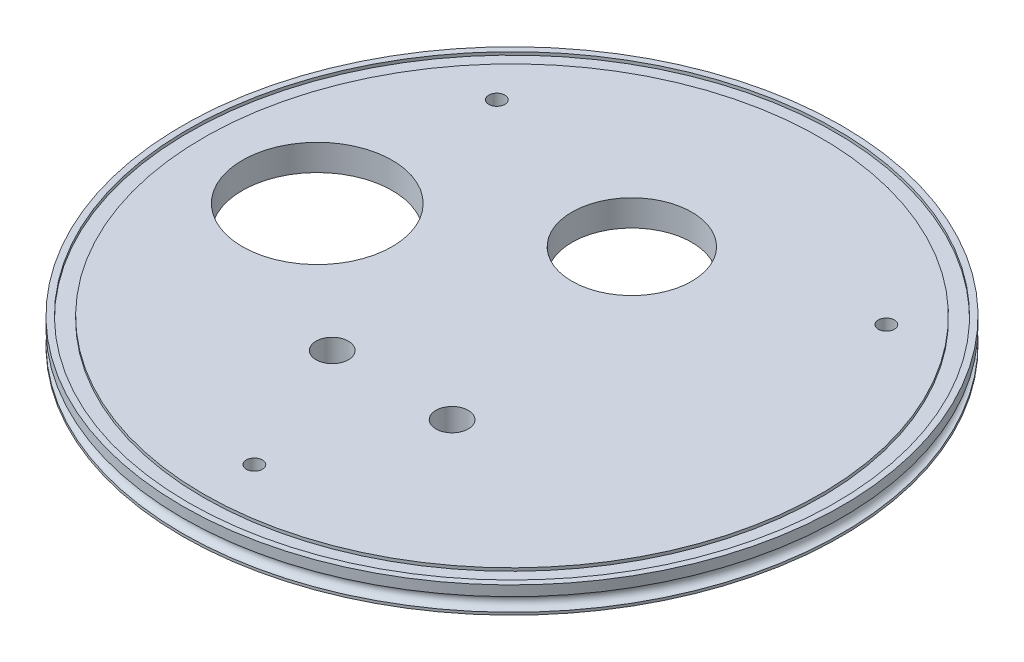
ISO-10303-21;
HEADER;
FILE_DESCRIPTION(('STEP AP214'),'2;1');
FILE_NAME('part.step','',(''),(''),'','','');
FILE_SCHEMA(('AUTOMOTIVE_DESIGN { 1 0 10303 214 1 1 1 1 }'));
ENDSEC;
DATA;
#1=APPLICATION_CONTEXT('core data for automotive mechanical design processes');
#2=APPLICATION_PROTOCOL_DEFINITION('international standard','automotive_design',2000,#1);
#3=PRODUCT_CONTEXT('',#1,'mechanical');
#4=PRODUCT('Part','Part','',(#3));
#5=PRODUCT_RELATED_PRODUCT_CATEGORY('part','',(#4));
#6=PRODUCT_DEFINITION_FORMATION('','',#4);
#7=PRODUCT_DEFINITION_CONTEXT('part definition',#1,'design');
#8=PRODUCT_DEFINITION('design','',#6,#7);
#9=PRODUCT_DEFINITION_SHAPE('','',#8);
#10=(LENGTH_UNIT() NAMED_UNIT(*) SI_UNIT(.MILLI.,.METRE.));
#11=(NAMED_UNIT(*) PLANE_ANGLE_UNIT() SI_UNIT($,.RADIAN.));
#12=(NAMED_UNIT(*) SI_UNIT($,.STERADIAN.) SOLID_ANGLE_UNIT());
#13=UNCERTAINTY_MEASURE_WITH_UNIT(LENGTH_MEASURE(1.E-05),#10,'distance_accuracy_value','');
#14=(GEOMETRIC_REPRESENTATION_CONTEXT(3) GLOBAL_UNCERTAINTY_ASSIGNED_CONTEXT((#13)) GLOBAL_UNIT_ASSIGNED_CONTEXT((#10,
#11,#12)) REPRESENTATION_CONTEXT('',''));
#15=CARTESIAN_POINT('',(0.,0.,0.));
#16=DIRECTION('',(0.,0.,1.));
#17=DIRECTION('',(1.,0.,0.));
#18=AXIS2_PLACEMENT_3D('',#15,#16,#17);
#19=CARTESIAN_POINT('',(0.,3.93699999999996,0.));
#20=DIRECTION('',(0.,1.,0.));
#21=DIRECTION('',(0.,0.,1.));
#22=AXIS2_PLACEMENT_3D('',#19,#20,#21);
#23=TOROIDAL_SURFACE('',#22,139.7,2.8575);
#24=CARTESIAN_POINT('',(0.,1.07949999999997,0.));
#25=DIRECTION('',(0.,1.,0.));
#26=DIRECTION('',(0.,0.,1.));
#27=AXIS2_PLACEMENT_3D('',#24,#25,#26);
#28=CIRCLE('',#27,139.7);
#29=CARTESIAN_POINT('',(0.,1.07949999999997,139.7));
#30=VERTEX_POINT('',#29);
#31=EDGE_CURVE('E89',#30,#30,#28,.T.);
#32=ORIENTED_EDGE('',*,*,#31,.T.);
#33=EDGE_LOOP('',(#32));
#34=FACE_BOUND('',#33,.T.);
#35=CARTESIAN_POINT('',(0.,6.79449999999996,0.));
#36=DIRECTION('',(0.,1.,0.));
#37=DIRECTION('',(0.,0.,1.));
#38=AXIS2_PLACEMENT_3D('',#35,#36,#37);
#39=CIRCLE('',#38,139.7);
#40=CARTESIAN_POINT('',(0.,6.79449999999996,139.7));
#41=VERTEX_POINT('',#40);
#42=EDGE_CURVE('E10',#41,#41,#39,.T.);
#43=ORIENTED_EDGE('',*,*,#42,.F.);
#44=EDGE_LOOP('',(#43));
#45=FACE_BOUND('',#44,.T.);
#46=ADVANCED_FACE('F32',(#34,#45),#23,.F.);
#47=CARTESIAN_POINT('',(0.,28.206974459725,0.));
#48=DIRECTION('',(0.,1.,0.));
#49=DIRECTION('',(0.,0.,1.));
#50=AXIS2_PLACEMENT_3D('',#47,#48,#49);
#51=CYLINDRICAL_SURFACE('',#50,139.7);
#52=ORIENTED_EDGE('',*,*,#42,.T.);
#53=EDGE_LOOP('',(#52));
#54=FACE_BOUND('',#53,.T.);
#55=CARTESIAN_POINT('',(0.,11.1125,0.));
#56=DIRECTION('',(0.,1.,0.));
#57=DIRECTION('',(0.,0.,1.));
#58=AXIS2_PLACEMENT_3D('',#55,#56,#57);
#59=CIRCLE('',#58,139.7);
#60=CARTESIAN_POINT('',(0.,11.1125,139.7));
#61=VERTEX_POINT('',#60);
#62=EDGE_CURVE('E39',#61,#61,#59,.T.);
#63=ORIENTED_EDGE('',*,*,#62,.F.);
#64=EDGE_LOOP('',(#63));
#65=FACE_BOUND('',#64,.T.);
#66=ADVANCED_FACE('F125',(#54,#65),#51,.T.);
#67=CARTESIAN_POINT('',(0.,11.1125,0.));
#68=DIRECTION('',(0.,-1.,0.));
#69=DIRECTION('',(0.,0.,-1.));
#70=AXIS2_PLACEMENT_3D('',#67,#68,#69);
#71=PLANE('',#70);
#72=CARTESIAN_POINT('',(0.,11.1125,0.));
#73=DIRECTION('',(0.,1.,0.));
#74=DIRECTION('',(0.,0.,1.));
#75=AXIS2_PLACEMENT_3D('',#72,#73,#74);
#76=CIRCLE('',#75,137.16);
#77=CARTESIAN_POINT('',(0.,11.1125,137.16));
#78=VERTEX_POINT('',#77);
#79=EDGE_CURVE('E44',#78,#78,#76,.T.);
#80=ORIENTED_EDGE('',*,*,#79,.F.);
#81=EDGE_LOOP('',(#80));
#82=FACE_BOUND('',#81,.T.);
#83=ORIENTED_EDGE('',*,*,#62,.T.);
#84=EDGE_LOOP('',(#83));
#85=FACE_BOUND('',#84,.T.);
#86=ADVANCED_FACE('F122',(#82,#85),#71,.F.);
#87=CARTESIAN_POINT('',(0.,28.206974459725,0.));
#88=DIRECTION('',(0.,1.,0.));
#89=DIRECTION('',(0.,0.,1.));
#90=AXIS2_PLACEMENT_3D('',#87,#88,#89);
#91=CYLINDRICAL_SURFACE('',#90,137.16);
#92=CARTESIAN_POINT('',(0.,9.8425,0.));
#93=DIRECTION('',(0.,1.,0.));
#94=DIRECTION('',(0.,0.,1.));
#95=AXIS2_PLACEMENT_3D('',#92,#93,#94);
#96=CIRCLE('',#95,137.16);
#97=CARTESIAN_POINT('',(0.,9.8425,137.16));
#98=VERTEX_POINT('',#97);
#99=EDGE_CURVE('E115',#98,#98,#96,.T.);
#100=ORIENTED_EDGE('',*,*,#99,.F.);
#101=EDGE_LOOP('',(#100));
#102=FACE_BOUND('',#101,.T.);
#103=ORIENTED_EDGE('',*,*,#79,.T.);
#104=EDGE_LOOP('',(#103));
#105=FACE_BOUND('',#104,.T.);
#106=ADVANCED_FACE('F120',(#102,#105),#91,.F.);
#107=CARTESIAN_POINT('',(0.,9.8425,0.));
#108=DIRECTION('',(0.,-1.,0.));
#109=DIRECTION('',(0.,0.,-1.));
#110=AXIS2_PLACEMENT_3D('',#107,#108,#109);
#111=PLANE('',#110);
#112=CARTESIAN_POINT('',(0.,9.8425,0.));
#113=DIRECTION('',(0.,1.,0.));
#114=DIRECTION('',(0.,0.,1.));
#115=AXIS2_PLACEMENT_3D('',#112,#113,#114);
#116=CIRCLE('',#115,130.81);
#117=CARTESIAN_POINT('',(0.,9.8425,130.81));
#118=VERTEX_POINT('',#117);
#119=EDGE_CURVE('E112',#118,#118,#116,.T.);
#120=ORIENTED_EDGE('',*,*,#119,.F.);
#121=EDGE_LOOP('',(#120));
#122=FACE_BOUND('',#121,.T.);
#123=ORIENTED_EDGE('',*,*,#99,.T.);
#124=EDGE_LOOP('',(#123));
#125=FACE_BOUND('',#124,.T.);
#126=ADVANCED_FACE('F137',(#122,#125),#111,.F.);
#127=CARTESIAN_POINT('',(0.,28.206974459725,0.));
#128=DIRECTION('',(0.,1.,0.));
#129=DIRECTION('',(0.,0.,1.));
#130=AXIS2_PLACEMENT_3D('',#127,#128,#129);
#131=CYLINDRICAL_SURFACE('',#130,130.81);
#132=CARTESIAN_POINT('',(0.,11.1125,0.));
#133=DIRECTION('',(0.,1.,0.));
#134=DIRECTION('',(0.,0.,1.));
#135=AXIS2_PLACEMENT_3D('',#132,#133,#134);
#136=CIRCLE('',#135,130.81);
#137=CARTESIAN_POINT('',(0.,11.1125,130.81));
#138=VERTEX_POINT('',#137);
#139=EDGE_CURVE('E109',#138,#138,#136,.T.);
#140=ORIENTED_EDGE('',*,*,#139,.F.);
#141=EDGE_LOOP('',(#140));
#142=FACE_BOUND('',#141,.T.);
#143=ORIENTED_EDGE('',*,*,#119,.T.);
#144=EDGE_LOOP('',(#143));
#145=FACE_BOUND('',#144,.T.);
#146=ADVANCED_FACE('F141',(#142,#145),#131,.T.);
#147=CARTESIAN_POINT('',(0.,11.1125,0.));
#148=DIRECTION('',(0.,1.,0.));
#149=DIRECTION('',(0.,0.,1.));
#150=AXIS2_PLACEMENT_3D('',#147,#148,#149);
#151=PLANE('',#150);
#152=CARTESIAN_POINT('',(-82.55,11.1125,-76.1273478048267));
#153=DIRECTION('',(0.,1.,0.));
#154=DIRECTION('',(0.,0.,1.));
#155=AXIS2_PLACEMENT_3D('',#152,#153,#154);
#156=CIRCLE('',#155,3.429);
#157=CARTESIAN_POINT('',(-82.55,11.1125,-72.6983478048267));
#158=VERTEX_POINT('',#157);
#159=EDGE_CURVE('E242',#158,#158,#156,.T.);
#160=ORIENTED_EDGE('',*,*,#159,.F.);
#161=EDGE_LOOP('',(#160));
#162=FACE_BOUND('',#161,.T.);
#163=CARTESIAN_POINT('',(82.55,11.1125,-76.1273478048268));
#164=DIRECTION('',(0.,1.,0.));
#165=DIRECTION('',(0.,0.,1.));
#166=AXIS2_PLACEMENT_3D('',#163,#164,#165);
#167=CIRCLE('',#166,3.429);
#168=CARTESIAN_POINT('',(82.55,11.1125,-72.6983478048268));
#169=VERTEX_POINT('',#168);
#170=EDGE_CURVE('E241',#169,#169,#167,.T.);
#171=ORIENTED_EDGE('',*,*,#170,.F.);
#172=EDGE_LOOP('',(#171));
#173=FACE_BOUND('',#172,.T.);
#174=CARTESIAN_POINT('',(0.,11.1125,109.22));
#175=DIRECTION('',(0.,1.,0.));
#176=DIRECTION('',(0.,0.,1.));
#177=AXIS2_PLACEMENT_3D('',#174,#175,#176);
#178=CIRCLE('',#177,3.42900000000001);
#179=CARTESIAN_POINT('',(0.,11.1125,112.649));
#180=VERTEX_POINT('',#179);
#181=EDGE_CURVE('E251',#180,#180,#178,.T.);
#182=ORIENTED_EDGE('',*,*,#181,.F.);
#183=EDGE_LOOP('',(#182));
#184=FACE_BOUND('',#183,.T.);
#185=CARTESIAN_POINT('',(-82.55,11.1125,0.));
#186=DIRECTION('',(0.,1.,0.));
#187=DIRECTION('',(0.,0.,1.));
#188=AXIS2_PLACEMENT_3D('',#185,#186,#187);
#189=CIRCLE('',#188,31.75);
#190=CARTESIAN_POINT('',(-82.55,11.1125,31.75));
#191=VERTEX_POINT('',#190);
#192=EDGE_CURVE('E50',#191,#191,#189,.T.);
#193=ORIENTED_EDGE('',*,*,#192,.F.);
#194=EDGE_LOOP('',(#193));
#195=FACE_BOUND('',#194,.T.);
#196=CARTESIAN_POINT('',(0.,11.1125,-50.8));
#197=DIRECTION('',(0.,1.,0.));
#198=DIRECTION('',(0.,0.,1.));
#199=AXIS2_PLACEMENT_3D('',#196,#197,#198);
#200=CIRCLE('',#199,25.4);
#201=CARTESIAN_POINT('',(0.,11.1125,-25.4));
#202=VERTEX_POINT('',#201);
#203=EDGE_CURVE('E71',#202,#202,#200,.T.);
#204=ORIENTED_EDGE('',*,*,#203,.F.);
#205=EDGE_LOOP('',(#204));
#206=FACE_BOUND('',#205,.T.);
#207=CARTESIAN_POINT('',(25.4,11.1125,50.8));
#208=DIRECTION('',(0.,1.,0.));
#209=DIRECTION('',(0.,0.,1.));
#210=AXIS2_PLACEMENT_3D('',#207,#208,#209);
#211=CIRCLE('',#210,6.858);
#212=CARTESIAN_POINT('',(25.4,11.1125,57.658));
#213=VERTEX_POINT('',#212);
#214=EDGE_CURVE('E77',#213,#213,#211,.T.);
#215=ORIENTED_EDGE('',*,*,#214,.F.);
#216=EDGE_LOOP('',(#215));
#217=FACE_BOUND('',#216,.T.);
#218=CARTESIAN_POINT('',(-25.4,11.1125,50.8));
#219=DIRECTION('',(0.,1.,0.));
#220=DIRECTION('',(0.,0.,1.));
#221=AXIS2_PLACEMENT_3D('',#218,#219,#220);
#222=CIRCLE('',#221,6.858);
#223=CARTESIAN_POINT('',(-25.4,11.1125,57.658));
#224=VERTEX_POINT('',#223);
#225=EDGE_CURVE('E83',#224,#224,#222,.T.);
#226=ORIENTED_EDGE('',*,*,#225,.F.);
#227=EDGE_LOOP('',(#226));
#228=FACE_BOUND('',#227,.T.);
#229=ORIENTED_EDGE('',*,*,#139,.T.);
#230=EDGE_LOOP('',(#229));
#231=FACE_BOUND('',#230,.T.);
#232=ADVANCED_FACE('F145',(#162,#173,#184,#195,#206,#217,#228,#231),#151,.T.);
#233=CARTESIAN_POINT('',(0.,0.,0.));
#234=DIRECTION('',(0.,-1.,0.));
#235=DIRECTION('',(0.,0.,-1.));
#236=AXIS2_PLACEMENT_3D('',#233,#234,#235);
#237=PLANE('',#236);
#238=CARTESIAN_POINT('',(-48.26,0.,-31.75));
#239=DIRECTION('',(0.,-1.,0.));
#240=DIRECTION('',(0.,0.,-1.));
#241=AXIS2_PLACEMENT_3D('',#238,#239,#240);
#242=CIRCLE('',#241,3.429);
#243=CARTESIAN_POINT('',(-48.26,0.,-35.179));
#244=VERTEX_POINT('',#243);
#245=EDGE_CURVE('E35',#244,#244,#242,.T.);
#246=ORIENTED_EDGE('',*,*,#245,.F.);
#247=EDGE_LOOP('',(#246));
#248=FACE_BOUND('',#247,.T.);
#249=CARTESIAN_POINT('',(-48.26,0.,31.75));
#250=DIRECTION('',(0.,-1.,0.));
#251=DIRECTION('',(0.,0.,-1.));
#252=AXIS2_PLACEMENT_3D('',#249,#250,#251);
#253=CIRCLE('',#252,3.429);
#254=CARTESIAN_POINT('',(-48.26,0.,28.321));
#255=VERTEX_POINT('',#254);
#256=EDGE_CURVE('E52',#255,#255,#253,.T.);
#257=ORIENTED_EDGE('',*,*,#256,.F.);
#258=EDGE_LOOP('',(#257));
#259=FACE_BOUND('',#258,.T.);
#260=CARTESIAN_POINT('',(57.15,0.,0.));
#261=DIRECTION('',(0.,-1.,0.));
#262=DIRECTION('',(0.,0.,-1.));
#263=AXIS2_PLACEMENT_3D('',#260,#261,#262);
#264=CIRCLE('',#263,3.429);
#265=CARTESIAN_POINT('',(57.15,0.,-3.429));
#266=VERTEX_POINT('',#265);
#267=EDGE_CURVE('E48',#266,#266,#264,.T.);
#268=ORIENTED_EDGE('',*,*,#267,.F.);
#269=EDGE_LOOP('',(#268));
#270=FACE_BOUND('',#269,.T.);
#271=CARTESIAN_POINT('',(-82.55,0.,0.));
#272=DIRECTION('',(0.,1.,0.));
#273=DIRECTION('',(0.,0.,1.));
#274=AXIS2_PLACEMENT_3D('',#271,#272,#273);
#275=CIRCLE('',#274,31.75);
#276=CARTESIAN_POINT('',(-82.55,0.,31.75));
#277=VERTEX_POINT('',#276);
#278=EDGE_CURVE('E68',#277,#277,#275,.T.);
#279=ORIENTED_EDGE('',*,*,#278,.T.);
#280=EDGE_LOOP('',(#279));
#281=FACE_BOUND('',#280,.T.);
#282=CARTESIAN_POINT('',(0.,0.,-50.8));
#283=DIRECTION('',(0.,1.,0.));
#284=DIRECTION('',(0.,0.,1.));
#285=AXIS2_PLACEMENT_3D('',#282,#283,#284);
#286=CIRCLE('',#285,25.4);
#287=CARTESIAN_POINT('',(0.,0.,-25.4));
#288=VERTEX_POINT('',#287);
#289=EDGE_CURVE('E74',#288,#288,#286,.T.);
#290=ORIENTED_EDGE('',*,*,#289,.T.);
#291=EDGE_LOOP('',(#290));
#292=FACE_BOUND('',#291,.T.);
#293=CARTESIAN_POINT('',(25.4,0.,50.8));
#294=DIRECTION('',(0.,1.,0.));
#295=DIRECTION('',(0.,0.,1.));
#296=AXIS2_PLACEMENT_3D('',#293,#294,#295);
#297=CIRCLE('',#296,6.858);
#298=CARTESIAN_POINT('',(25.4,0.,57.658));
#299=VERTEX_POINT('',#298);
#300=EDGE_CURVE('E80',#299,#299,#297,.T.);
#301=ORIENTED_EDGE('',*,*,#300,.T.);
#302=EDGE_LOOP('',(#301));
#303=FACE_BOUND('',#302,.T.);
#304=CARTESIAN_POINT('',(-25.4,0.,50.8));
#305=DIRECTION('',(0.,1.,0.));
#306=DIRECTION('',(0.,0.,1.));
#307=AXIS2_PLACEMENT_3D('',#304,#305,#306);
#308=CIRCLE('',#307,6.858);
#309=CARTESIAN_POINT('',(-25.4,0.,57.658));
#310=VERTEX_POINT('',#309);
#311=EDGE_CURVE('E86',#310,#310,#308,.T.);
#312=ORIENTED_EDGE('',*,*,#311,.T.);
#313=EDGE_LOOP('',(#312));
#314=FACE_BOUND('',#313,.T.);
#315=CARTESIAN_POINT('',(0.,0.,0.));
#316=DIRECTION('',(0.,1.,0.));
#317=DIRECTION('',(0.,0.,1.));
#318=AXIS2_PLACEMENT_3D('',#315,#316,#317);
#319=CIRCLE('',#318,120.65);
#320=CARTESIAN_POINT('',(0.,0.,120.65));
#321=VERTEX_POINT('',#320);
#322=EDGE_CURVE('E106',#321,#321,#319,.T.);
#323=ORIENTED_EDGE('',*,*,#322,.F.);
#324=EDGE_LOOP('',(#323));
#325=FACE_BOUND('',#324,.T.);
#326=ADVANCED_FACE('F149',(#248,#259,#270,#281,#292,#303,#314,#325),#237,.T.);
#327=CARTESIAN_POINT('',(0.,28.206974459725,0.));
#328=DIRECTION('',(0.,1.,0.));
#329=DIRECTION('',(0.,0.,1.));
#330=AXIS2_PLACEMENT_3D('',#327,#328,#329);
#331=CYLINDRICAL_SURFACE('',#330,120.65);
#332=ORIENTED_EDGE('',*,*,#322,.T.);
#333=EDGE_LOOP('',(#332));
#334=FACE_BOUND('',#333,.T.);
#335=CARTESIAN_POINT('',(0.,2.54,0.));
#336=DIRECTION('',(0.,1.,0.));
#337=DIRECTION('',(0.,0.,1.));
#338=AXIS2_PLACEMENT_3D('',#335,#336,#337);
#339=CIRCLE('',#338,120.65);
#340=CARTESIAN_POINT('',(0.,2.54,120.65));
#341=VERTEX_POINT('',#340);
#342=EDGE_CURVE('E103',#341,#341,#339,.T.);
#343=ORIENTED_EDGE('',*,*,#342,.F.);
#344=EDGE_LOOP('',(#343));
#345=FACE_BOUND('',#344,.T.);
#346=ADVANCED_FACE('F153',(#334,#345),#331,.T.);
#347=CARTESIAN_POINT('',(0.,2.54,0.));
#348=DIRECTION('',(0.,-1.,0.));
#349=DIRECTION('',(0.,0.,-1.));
#350=AXIS2_PLACEMENT_3D('',#347,#348,#349);
#351=PLANE('',#350);
#352=ORIENTED_EDGE('',*,*,#342,.T.);
#353=EDGE_LOOP('',(#352));
#354=FACE_BOUND('',#353,.T.);
#355=CARTESIAN_POINT('',(0.,2.54,0.));
#356=DIRECTION('',(0.,1.,0.));
#357=DIRECTION('',(0.,0.,1.));
#358=AXIS2_PLACEMENT_3D('',#355,#356,#357);
#359=CIRCLE('',#358,127.);
#360=CARTESIAN_POINT('',(0.,2.54,127.));
#361=VERTEX_POINT('',#360);
#362=EDGE_CURVE('E100',#361,#361,#359,.T.);
#363=ORIENTED_EDGE('',*,*,#362,.F.);
#364=EDGE_LOOP('',(#363));
#365=FACE_BOUND('',#364,.T.);
#366=ADVANCED_FACE('F157',(#354,#365),#351,.T.);
#367=CARTESIAN_POINT('',(0.,28.206974459725,0.));
#368=DIRECTION('',(0.,1.,0.));
#369=DIRECTION('',(0.,0.,1.));
#370=AXIS2_PLACEMENT_3D('',#367,#368,#369);
#371=CYLINDRICAL_SURFACE('',#370,127.);
#372=ORIENTED_EDGE('',*,*,#362,.T.);
#373=EDGE_LOOP('',(#372));
#374=FACE_BOUND('',#373,.T.);
#375=CARTESIAN_POINT('',(0.,0.,0.));
#376=DIRECTION('',(0.,1.,0.));
#377=DIRECTION('',(0.,0.,1.));
#378=AXIS2_PLACEMENT_3D('',#375,#376,#377);
#379=CIRCLE('',#378,127.);
#380=CARTESIAN_POINT('',(0.,0.,127.));
#381=VERTEX_POINT('',#380);
#382=EDGE_CURVE('E97',#381,#381,#379,.T.);
#383=ORIENTED_EDGE('',*,*,#382,.F.);
#384=EDGE_LOOP('',(#383));
#385=FACE_BOUND('',#384,.T.);
#386=ADVANCED_FACE('F161',(#374,#385),#371,.F.);
#387=CARTESIAN_POINT('',(0.,0.,0.));
#388=DIRECTION('',(0.,-1.,0.));
#389=DIRECTION('',(0.,0.,-1.));
#390=AXIS2_PLACEMENT_3D('',#387,#388,#389);
#391=PLANE('',#390);
#392=ORIENTED_EDGE('',*,*,#382,.T.);
#393=EDGE_LOOP('',(#392));
#394=FACE_BOUND('',#393,.T.);
#395=CARTESIAN_POINT('',(0.,0.,0.));
#396=DIRECTION('',(0.,1.,0.));
#397=DIRECTION('',(0.,0.,1.));
#398=AXIS2_PLACEMENT_3D('',#395,#396,#397);
#399=CIRCLE('',#398,139.7);
#400=CARTESIAN_POINT('',(0.,0.,139.7));
#401=VERTEX_POINT('',#400);
#402=EDGE_CURVE('E94',#401,#401,#399,.T.);
#403=ORIENTED_EDGE('',*,*,#402,.F.);
#404=EDGE_LOOP('',(#403));
#405=FACE_BOUND('',#404,.T.);
#406=ADVANCED_FACE('F165',(#394,#405),#391,.T.);
#407=CARTESIAN_POINT('',(0.,28.206974459725,0.));
#408=DIRECTION('',(0.,1.,0.));
#409=DIRECTION('',(0.,0.,1.));
#410=AXIS2_PLACEMENT_3D('',#407,#408,#409);
#411=CYLINDRICAL_SURFACE('',#410,139.7);
#412=ORIENTED_EDGE('',*,*,#402,.T.);
#413=EDGE_LOOP('',(#412));
#414=FACE_BOUND('',#413,.T.);
#415=ORIENTED_EDGE('',*,*,#31,.F.);
#416=EDGE_LOOP('',(#415));
#417=FACE_BOUND('',#416,.T.);
#418=ADVANCED_FACE('F169',(#414,#417),#411,.T.);
#419=CARTESIAN_POINT('',(-25.4,0.,50.8));
#420=DIRECTION('',(0.,1.,0.));
#421=DIRECTION('',(0.,0.,1.));
#422=AXIS2_PLACEMENT_3D('',#419,#420,#421);
#423=CYLINDRICAL_SURFACE('',#422,6.858);
#424=ORIENTED_EDGE('',*,*,#311,.F.);
#425=EDGE_LOOP('',(#424));
#426=FACE_BOUND('',#425,.T.);
#427=ORIENTED_EDGE('',*,*,#225,.T.);
#428=EDGE_LOOP('',(#427));
#429=FACE_BOUND('',#428,.T.);
#430=ADVANCED_FACE('F173',(#426,#429),#423,.F.);
#431=CARTESIAN_POINT('',(25.4,0.,50.8));
#432=DIRECTION('',(0.,1.,0.));
#433=DIRECTION('',(0.,0.,1.));
#434=AXIS2_PLACEMENT_3D('',#431,#432,#433);
#435=CYLINDRICAL_SURFACE('',#434,6.858);
#436=ORIENTED_EDGE('',*,*,#300,.F.);
#437=EDGE_LOOP('',(#436));
#438=FACE_BOUND('',#437,.T.);
#439=ORIENTED_EDGE('',*,*,#214,.T.);
#440=EDGE_LOOP('',(#439));
#441=FACE_BOUND('',#440,.T.);
#442=ADVANCED_FACE('F177',(#438,#441),#435,.F.);
#443=CARTESIAN_POINT('',(0.,0.,-50.8));
#444=DIRECTION('',(0.,1.,0.));
#445=DIRECTION('',(0.,0.,1.));
#446=AXIS2_PLACEMENT_3D('',#443,#444,#445);
#447=CYLINDRICAL_SURFACE('',#446,25.4);
#448=ORIENTED_EDGE('',*,*,#289,.F.);
#449=EDGE_LOOP('',(#448));
#450=FACE_BOUND('',#449,.T.);
#451=ORIENTED_EDGE('',*,*,#203,.T.);
#452=EDGE_LOOP('',(#451));
#453=FACE_BOUND('',#452,.T.);
#454=ADVANCED_FACE('F181',(#450,#453),#447,.F.);
#455=CARTESIAN_POINT('',(-82.55,0.,0.));
#456=DIRECTION('',(0.,1.,0.));
#457=DIRECTION('',(0.,0.,1.));
#458=AXIS2_PLACEMENT_3D('',#455,#456,#457);
#459=CYLINDRICAL_SURFACE('',#458,31.75);
#460=ORIENTED_EDGE('',*,*,#278,.F.);
#461=EDGE_LOOP('',(#460));
#462=FACE_BOUND('',#461,.T.);
#463=ORIENTED_EDGE('',*,*,#192,.T.);
#464=EDGE_LOOP('',(#463));
#465=FACE_BOUND('',#464,.T.);
#466=ADVANCED_FACE('F185',(#462,#465),#459,.F.);
#467=CARTESIAN_POINT('',(57.15,-0.0635000000000175,0.));
#468=DIRECTION('',(0.,1.,0.));
#469=DIRECTION('',(0.,0.,1.));
#470=AXIS2_PLACEMENT_3D('',#467,#468,#469);
#471=CYLINDRICAL_SURFACE('',#470,3.429);
#472=ORIENTED_EDGE('',*,*,#267,.T.);
#473=EDGE_LOOP('',(#472));
#474=FACE_BOUND('',#473,.T.);
#475=CARTESIAN_POINT('',(57.15,6.28649999999998,0.));
#476=DIRECTION('',(0.,1.,0.));
#477=DIRECTION('',(0.,0.,1.));
#478=AXIS2_PLACEMENT_3D('',#475,#476,#477);
#479=CIRCLE('',#478,3.429);
#480=CARTESIAN_POINT('',(57.15,6.28649999999998,3.429));
#481=VERTEX_POINT('',#480);
#482=EDGE_CURVE('E51',#481,#481,#479,.T.);
#483=ORIENTED_EDGE('',*,*,#482,.T.);
#484=EDGE_LOOP('',(#483));
#485=FACE_BOUND('',#484,.T.);
#486=ADVANCED_FACE('F189',(#474,#485),#471,.F.);
#487=CARTESIAN_POINT('',(57.15,6.28649999999998,0.));
#488=DIRECTION('',(0.,1.,0.));
#489=DIRECTION('',(0.,0.,1.));
#490=AXIS2_PLACEMENT_3D('',#487,#488,#489);
#491=PLANE('',#490);
#492=ORIENTED_EDGE('',*,*,#482,.F.);
#493=EDGE_LOOP('',(#492));
#494=FACE_BOUND('',#493,.T.);
#495=ADVANCED_FACE('F193',(#494),#491,.F.);
#496=CARTESIAN_POINT('',(-48.26,-0.0635000000000175,31.75));
#497=DIRECTION('',(0.,1.,0.));
#498=DIRECTION('',(0.,0.,1.));
#499=AXIS2_PLACEMENT_3D('',#496,#497,#498);
#500=CYLINDRICAL_SURFACE('',#499,3.429);
#501=ORIENTED_EDGE('',*,*,#256,.T.);
#502=EDGE_LOOP('',(#501));
#503=FACE_BOUND('',#502,.T.);
#504=CARTESIAN_POINT('',(-48.26,6.28649999999998,31.75));
#505=DIRECTION('',(0.,1.,0.));
#506=DIRECTION('',(0.,0.,1.));
#507=AXIS2_PLACEMENT_3D('',#504,#505,#506);
#508=CIRCLE('',#507,3.429);
#509=CARTESIAN_POINT('',(-48.26,6.28649999999998,35.179));
#510=VERTEX_POINT('',#509);
#511=EDGE_CURVE('E54',#510,#510,#508,.T.);
#512=ORIENTED_EDGE('',*,*,#511,.T.);
#513=EDGE_LOOP('',(#512));
#514=FACE_BOUND('',#513,.T.);
#515=ADVANCED_FACE('F197',(#503,#514),#500,.F.);
#516=CARTESIAN_POINT('',(-48.26,6.28649999999998,31.75));
#517=DIRECTION('',(0.,1.,0.));
#518=DIRECTION('',(0.,0.,1.));
#519=AXIS2_PLACEMENT_3D('',#516,#517,#518);
#520=PLANE('',#519);
#521=ORIENTED_EDGE('',*,*,#511,.F.);
#522=EDGE_LOOP('',(#521));
#523=FACE_BOUND('',#522,.T.);
#524=ADVANCED_FACE('F201',(#523),#520,.F.);
#525=CARTESIAN_POINT('',(-48.26,-0.0635000000000175,-31.75));
#526=DIRECTION('',(0.,1.,0.));
#527=DIRECTION('',(0.,0.,1.));
#528=AXIS2_PLACEMENT_3D('',#525,#526,#527);
#529=CYLINDRICAL_SURFACE('',#528,3.429);
#530=ORIENTED_EDGE('',*,*,#245,.T.);
#531=EDGE_LOOP('',(#530));
#532=FACE_BOUND('',#531,.T.);
#533=CARTESIAN_POINT('',(-48.26,6.28649999999998,-31.75));
#534=DIRECTION('',(0.,1.,0.));
#535=DIRECTION('',(0.,0.,1.));
#536=AXIS2_PLACEMENT_3D('',#533,#534,#535);
#537=CIRCLE('',#536,3.429);
#538=CARTESIAN_POINT('',(-48.26,6.28649999999998,-28.321));
#539=VERTEX_POINT('',#538);
#540=EDGE_CURVE('E64',#539,#539,#537,.T.);
#541=ORIENTED_EDGE('',*,*,#540,.T.);
#542=EDGE_LOOP('',(#541));
#543=FACE_BOUND('',#542,.T.);
#544=ADVANCED_FACE('F204',(#532,#543),#529,.F.);
#545=CARTESIAN_POINT('',(-48.26,6.28649999999998,-31.75));
#546=DIRECTION('',(0.,1.,0.));
#547=DIRECTION('',(0.,0.,1.));
#548=AXIS2_PLACEMENT_3D('',#545,#546,#547);
#549=PLANE('',#548);
#550=ORIENTED_EDGE('',*,*,#540,.F.);
#551=EDGE_LOOP('',(#550));
#552=FACE_BOUND('',#551,.T.);
#553=ADVANCED_FACE('F208',(#552),#549,.F.);
#554=CARTESIAN_POINT('',(0.,4.76249999999998,109.22));
#555=DIRECTION('',(0.,1.,0.));
#556=DIRECTION('',(0.,0.,1.));
#557=AXIS2_PLACEMENT_3D('',#554,#555,#556);
#558=CYLINDRICAL_SURFACE('',#557,3.42900000000001);
#559=CARTESIAN_POINT('',(0.,4.76249999999998,109.22));
#560=DIRECTION('',(0.,1.,0.));
#561=DIRECTION('',(0.,0.,1.));
#562=AXIS2_PLACEMENT_3D('',#559,#560,#561);
#563=CIRCLE('',#562,3.42900000000001);
#564=CARTESIAN_POINT('',(0.,4.76249999999998,112.649));
#565=VERTEX_POINT('',#564);
#566=EDGE_CURVE('E253',#565,#565,#563,.T.);
#567=ORIENTED_EDGE('',*,*,#566,.F.);
#568=EDGE_LOOP('',(#567));
#569=FACE_BOUND('',#568,.T.);
#570=ORIENTED_EDGE('',*,*,#181,.T.);
#571=EDGE_LOOP('',(#570));
#572=FACE_BOUND('',#571,.T.);
#573=ADVANCED_FACE('F212',(#569,#572),#558,.F.);
#574=CARTESIAN_POINT('',(0.,4.76249999999998,109.22));
#575=DIRECTION('',(0.,1.,0.));
#576=DIRECTION('',(0.,0.,1.));
#577=AXIS2_PLACEMENT_3D('',#574,#575,#576);
#578=PLANE('',#577);
#579=ORIENTED_EDGE('',*,*,#566,.T.);
#580=EDGE_LOOP('',(#579));
#581=FACE_BOUND('',#580,.T.);
#582=ADVANCED_FACE('F216',(#581),#578,.T.);
#583=CARTESIAN_POINT('',(82.55,4.76249999999998,-76.1273478048268));
#584=DIRECTION('',(0.,1.,0.));
#585=DIRECTION('',(0.,0.,1.));
#586=AXIS2_PLACEMENT_3D('',#583,#584,#585);
#587=CYLINDRICAL_SURFACE('',#586,3.429);
#588=CARTESIAN_POINT('',(82.55,4.76249999999998,-76.1273478048268));
#589=DIRECTION('',(0.,1.,0.));
#590=DIRECTION('',(0.,0.,1.));
#591=AXIS2_PLACEMENT_3D('',#588,#589,#590);
#592=CIRCLE('',#591,3.429);
#593=CARTESIAN_POINT('',(82.55,4.76249999999998,-72.6983478048268));
#594=VERTEX_POINT('',#593);
#595=EDGE_CURVE('E245',#594,#594,#592,.T.);
#596=ORIENTED_EDGE('',*,*,#595,.F.);
#597=EDGE_LOOP('',(#596));
#598=FACE_BOUND('',#597,.T.);
#599=ORIENTED_EDGE('',*,*,#170,.T.);
#600=EDGE_LOOP('',(#599));
#601=FACE_BOUND('',#600,.T.);
#602=ADVANCED_FACE('F220',(#598,#601),#587,.F.);
#603=CARTESIAN_POINT('',(82.55,4.76249999999998,-76.1273478048268));
#604=DIRECTION('',(0.,1.,0.));
#605=DIRECTION('',(0.,0.,1.));
#606=AXIS2_PLACEMENT_3D('',#603,#604,#605);
#607=PLANE('',#606);
#608=ORIENTED_EDGE('',*,*,#595,.T.);
#609=EDGE_LOOP('',(#608));
#610=FACE_BOUND('',#609,.T.);
#611=ADVANCED_FACE('F224',(#610),#607,.T.);
#612=CARTESIAN_POINT('',(-82.55,4.76249999999998,-76.1273478048267));
#613=DIRECTION('',(0.,1.,0.));
#614=DIRECTION('',(0.,0.,1.));
#615=AXIS2_PLACEMENT_3D('',#612,#613,#614);
#616=CYLINDRICAL_SURFACE('',#615,3.429);
#617=CARTESIAN_POINT('',(-82.55,4.76249999999998,-76.1273478048267));
#618=DIRECTION('',(0.,1.,0.));
#619=DIRECTION('',(0.,0.,1.));
#620=AXIS2_PLACEMENT_3D('',#617,#618,#619);
#621=CIRCLE('',#620,3.429);
#622=CARTESIAN_POINT('',(-82.55,4.76249999999998,-72.6983478048267));
#623=VERTEX_POINT('',#622);
#624=EDGE_CURVE('E240',#623,#623,#621,.T.);
#625=ORIENTED_EDGE('',*,*,#624,.F.);
#626=EDGE_LOOP('',(#625));
#627=FACE_BOUND('',#626,.T.);
#628=ORIENTED_EDGE('',*,*,#159,.T.);
#629=EDGE_LOOP('',(#628));
#630=FACE_BOUND('',#629,.T.);
#631=ADVANCED_FACE('F228',(#627,#630),#616,.F.);
#632=CARTESIAN_POINT('',(-82.55,4.76249999999998,-76.1273478048267));
#633=DIRECTION('',(0.,1.,0.));
#634=DIRECTION('',(0.,0.,1.));
#635=AXIS2_PLACEMENT_3D('',#632,#633,#634);
#636=PLANE('',#635);
#637=ORIENTED_EDGE('',*,*,#624,.T.);
#638=EDGE_LOOP('',(#637));
#639=FACE_BOUND('',#638,.T.);
#640=ADVANCED_FACE('F232',(#639),#636,.T.);
#641=CLOSED_SHELL('',(#46,#66,#86,#106,#126,#146,#232,#326,#346,#366,#386,#406,#418,#430,#442,
#454,#466,#486,#495,#515,#524,#544,#553,#573,#582,#602,#611,#631,#640));
#642=MANIFOLD_SOLID_BREP('B2',#641);
#643=ADVANCED_BREP_SHAPE_REPRESENTATION('',(#18,#642),#14);
#644=SHAPE_DEFINITION_REPRESENTATION(#9,#643);
ENDSEC;
END-ISO-10303-21;
